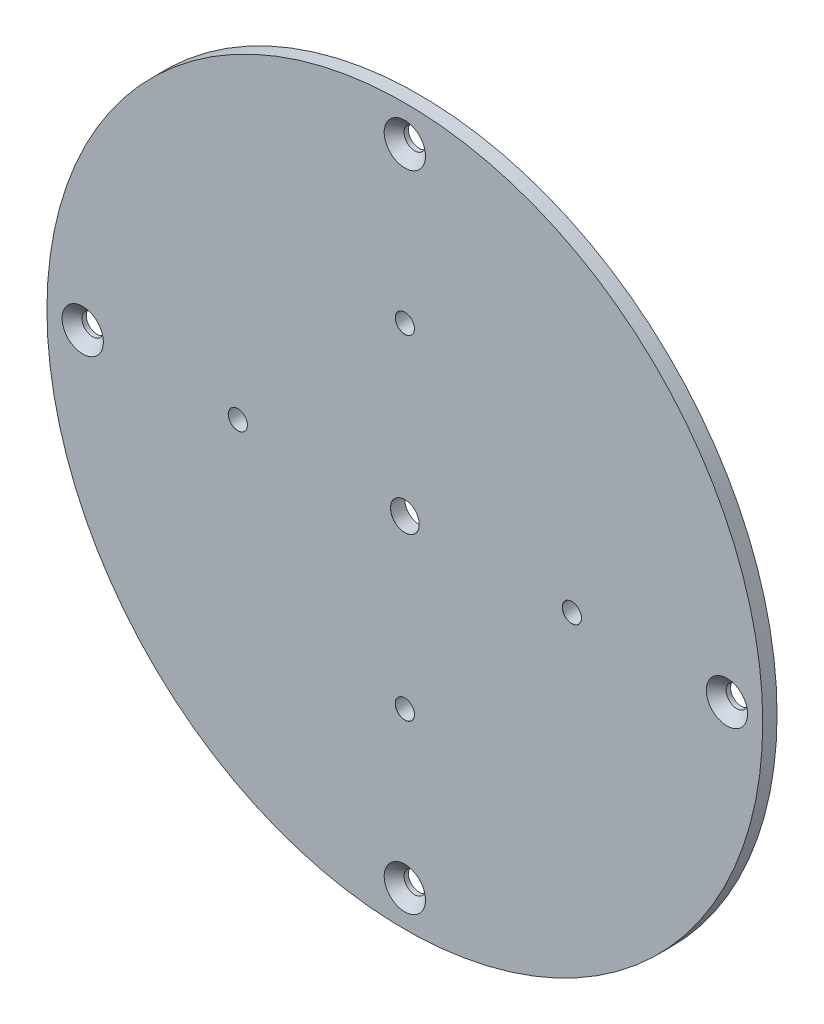
ISO-10303-21;
HEADER;
FILE_DESCRIPTION(('STEP AP214'),'2;1');
FILE_NAME('part.step','',(''),(''),'','','');
FILE_SCHEMA(('AUTOMOTIVE_DESIGN { 1 0 10303 214 1 1 1 1 }'));
ENDSEC;
DATA;
#1=APPLICATION_CONTEXT('core data for automotive mechanical design processes');
#2=APPLICATION_PROTOCOL_DEFINITION('international standard','automotive_design',2000,#1);
#3=PRODUCT_CONTEXT('',#1,'mechanical');
#4=PRODUCT('Part','Part','',(#3));
#5=PRODUCT_RELATED_PRODUCT_CATEGORY('part','',(#4));
#6=PRODUCT_DEFINITION_FORMATION('','',#4);
#7=PRODUCT_DEFINITION_CONTEXT('part definition',#1,'design');
#8=PRODUCT_DEFINITION('design','',#6,#7);
#9=PRODUCT_DEFINITION_SHAPE('','',#8);
#10=(LENGTH_UNIT() NAMED_UNIT(*) SI_UNIT(.MILLI.,.METRE.));
#11=(NAMED_UNIT(*) PLANE_ANGLE_UNIT() SI_UNIT($,.RADIAN.));
#12=(NAMED_UNIT(*) SI_UNIT($,.STERADIAN.) SOLID_ANGLE_UNIT());
#13=UNCERTAINTY_MEASURE_WITH_UNIT(LENGTH_MEASURE(1.E-05),#10,'distance_accuracy_value','');
#14=(GEOMETRIC_REPRESENTATION_CONTEXT(3) GLOBAL_UNCERTAINTY_ASSIGNED_CONTEXT((#13)) GLOBAL_UNIT_ASSIGNED_CONTEXT((#10,
#11,#12)) REPRESENTATION_CONTEXT('',''));
#15=CARTESIAN_POINT('',(0.,0.,0.));
#16=DIRECTION('',(0.,0.,1.));
#17=DIRECTION('',(1.,0.,0.));
#18=AXIS2_PLACEMENT_3D('',#15,#16,#17);
#19=CARTESIAN_POINT('',(0.,0.,6.));
#20=DIRECTION('',(0.,0.,-1.));
#21=DIRECTION('',(-1.,0.,0.));
#22=AXIS2_PLACEMENT_3D('',#19,#20,#21);
#23=CYLINDRICAL_SURFACE('',#22,150.);
#24=CARTESIAN_POINT('',(0.,0.,6.));
#25=DIRECTION('',(0.,0.,1.));
#26=DIRECTION('',(1.,0.,0.));
#27=AXIS2_PLACEMENT_3D('',#24,#25,#26);
#28=CIRCLE('',#27,150.);
#29=CARTESIAN_POINT('',(150.,0.,6.));
#30=VERTEX_POINT('',#29);
#31=EDGE_CURVE('E10',#30,#30,#28,.T.);
#32=ORIENTED_EDGE('',*,*,#31,.F.);
#33=EDGE_LOOP('',(#32));
#34=FACE_BOUND('',#33,.T.);
#35=CARTESIAN_POINT('',(0.,0.,0.));
#36=DIRECTION('',(0.,0.,1.));
#37=DIRECTION('',(1.,0.,0.));
#38=AXIS2_PLACEMENT_3D('',#35,#36,#37);
#39=CIRCLE('',#38,150.);
#40=CARTESIAN_POINT('',(150.,0.,0.));
#41=VERTEX_POINT('',#40);
#42=EDGE_CURVE('E37',#41,#41,#39,.T.);
#43=ORIENTED_EDGE('',*,*,#42,.T.);
#44=EDGE_LOOP('',(#43));
#45=FACE_BOUND('',#44,.T.);
#46=ADVANCED_FACE('F34',(#34,#45),#23,.T.);
#47=CARTESIAN_POINT('',(0.,0.,6.));
#48=DIRECTION('',(0.,0.,1.));
#49=DIRECTION('',(1.,0.,0.));
#50=AXIS2_PLACEMENT_3D('',#47,#48,#49);
#51=PLANE('',#50);
#52=CARTESIAN_POINT('',(0.,135.,6.));
#53=DIRECTION('',(0.,0.,1.));
#54=DIRECTION('',(1.,0.,0.));
#55=AXIS2_PLACEMENT_3D('',#52,#53,#54);
#56=CIRCLE('',#55,8.65);
#57=CARTESIAN_POINT('',(8.65,135.,6.));
#58=VERTEX_POINT('',#57);
#59=EDGE_CURVE('E123',#58,#58,#56,.T.);
#60=ORIENTED_EDGE('',*,*,#59,.F.);
#61=EDGE_LOOP('',(#60));
#62=FACE_BOUND('',#61,.T.);
#63=CARTESIAN_POINT('',(135.000000000004,3.81213167542181E-12,6.));
#64=DIRECTION('',(0.,0.,1.));
#65=DIRECTION('',(1.,0.,0.));
#66=AXIS2_PLACEMENT_3D('',#63,#64,#65);
#67=CIRCLE('',#66,8.64999999999999);
#68=CARTESIAN_POINT('',(143.650000000004,3.81213167542181E-12,6.));
#69=VERTEX_POINT('',#68);
#70=EDGE_CURVE('E114',#69,#69,#67,.T.);
#71=ORIENTED_EDGE('',*,*,#70,.F.);
#72=EDGE_LOOP('',(#71));
#73=FACE_BOUND('',#72,.T.);
#74=CARTESIAN_POINT('',(7.62426335084362E-12,-135.,6.));
#75=DIRECTION('',(0.,0.,1.));
#76=DIRECTION('',(1.,0.,0.));
#77=AXIS2_PLACEMENT_3D('',#74,#75,#76);
#78=CIRCLE('',#77,8.65);
#79=CARTESIAN_POINT('',(8.65000000000762,-135.,6.));
#80=VERTEX_POINT('',#79);
#81=EDGE_CURVE('E105',#80,#80,#78,.T.);
#82=ORIENTED_EDGE('',*,*,#81,.F.);
#83=EDGE_LOOP('',(#82));
#84=FACE_BOUND('',#83,.T.);
#85=CARTESIAN_POINT('',(-134.999999999996,-3.79559894363332E-12,6.));
#86=DIRECTION('',(0.,0.,1.));
#87=DIRECTION('',(1.,0.,0.));
#88=AXIS2_PLACEMENT_3D('',#85,#86,#87);
#89=CIRCLE('',#88,8.64999999999999);
#90=CARTESIAN_POINT('',(-126.349999999996,-3.79559894363332E-12,6.));
#91=VERTEX_POINT('',#90);
#92=EDGE_CURVE('E96',#91,#91,#89,.T.);
#93=ORIENTED_EDGE('',*,*,#92,.F.);
#94=EDGE_LOOP('',(#93));
#95=FACE_BOUND('',#94,.T.);
#96=CARTESIAN_POINT('',(0.,0.,6.));
#97=DIRECTION('',(0.,0.,1.));
#98=DIRECTION('',(1.,0.,0.));
#99=AXIS2_PLACEMENT_3D('',#96,#97,#98);
#100=CIRCLE('',#99,6.025);
#101=CARTESIAN_POINT('',(6.025,0.,6.));
#102=VERTEX_POINT('',#101);
#103=EDGE_CURVE('E87',#102,#102,#100,.T.);
#104=ORIENTED_EDGE('',*,*,#103,.F.);
#105=EDGE_LOOP('',(#104));
#106=FACE_BOUND('',#105,.T.);
#107=CARTESIAN_POINT('',(0.,70.,6.));
#108=DIRECTION('',(0.,0.,1.));
#109=DIRECTION('',(1.,0.,0.));
#110=AXIS2_PLACEMENT_3D('',#107,#108,#109);
#111=CIRCLE('',#110,4.025);
#112=CARTESIAN_POINT('',(4.025,70.,6.));
#113=VERTEX_POINT('',#112);
#114=EDGE_CURVE('E78',#113,#113,#111,.T.);
#115=ORIENTED_EDGE('',*,*,#114,.F.);
#116=EDGE_LOOP('',(#115));
#117=FACE_BOUND('',#116,.T.);
#118=CARTESIAN_POINT('',(0.,-70.,6.));
#119=DIRECTION('',(0.,0.,1.));
#120=DIRECTION('',(1.,0.,0.));
#121=AXIS2_PLACEMENT_3D('',#118,#119,#120);
#122=CIRCLE('',#121,4.025);
#123=CARTESIAN_POINT('',(4.025,-70.,6.));
#124=VERTEX_POINT('',#123);
#125=EDGE_CURVE('E69',#124,#124,#122,.T.);
#126=ORIENTED_EDGE('',*,*,#125,.F.);
#127=EDGE_LOOP('',(#126));
#128=FACE_BOUND('',#127,.T.);
#129=CARTESIAN_POINT('',(-70.,0.,6.));
#130=DIRECTION('',(0.,0.,1.));
#131=DIRECTION('',(1.,0.,0.));
#132=AXIS2_PLACEMENT_3D('',#129,#130,#131);
#133=CIRCLE('',#132,4.025);
#134=CARTESIAN_POINT('',(-65.975,0.,6.));
#135=VERTEX_POINT('',#134);
#136=EDGE_CURVE('E60',#135,#135,#133,.T.);
#137=ORIENTED_EDGE('',*,*,#136,.F.);
#138=EDGE_LOOP('',(#137));
#139=FACE_BOUND('',#138,.T.);
#140=CARTESIAN_POINT('',(70.,0.,6.));
#141=DIRECTION('',(0.,0.,1.));
#142=DIRECTION('',(1.,0.,0.));
#143=AXIS2_PLACEMENT_3D('',#140,#141,#142);
#144=CIRCLE('',#143,4.025);
#145=CARTESIAN_POINT('',(74.025,0.,6.));
#146=VERTEX_POINT('',#145);
#147=EDGE_CURVE('E51',#146,#146,#144,.T.);
#148=ORIENTED_EDGE('',*,*,#147,.F.);
#149=EDGE_LOOP('',(#148));
#150=FACE_BOUND('',#149,.T.);
#151=ORIENTED_EDGE('',*,*,#31,.T.);
#152=EDGE_LOOP('',(#151));
#153=FACE_BOUND('',#152,.T.);
#154=ADVANCED_FACE('F129',(#62,#73,#84,#95,#106,#117,#128,#139,#150,#153),#51,.T.);
#155=CARTESIAN_POINT('',(0.,0.,0.));
#156=DIRECTION('',(0.,0.,1.));
#157=DIRECTION('',(1.,0.,0.));
#158=AXIS2_PLACEMENT_3D('',#155,#156,#157);
#159=PLANE('',#158);
#160=CARTESIAN_POINT('',(0.,135.,0.));
#161=DIRECTION('',(0.,0.,1.));
#162=DIRECTION('',(1.,0.,0.));
#163=AXIS2_PLACEMENT_3D('',#160,#161,#162);
#164=CIRCLE('',#163,4.5);
#165=CARTESIAN_POINT('',(4.5,135.,0.));
#166=VERTEX_POINT('',#165);
#167=EDGE_CURVE('E117',#166,#166,#164,.T.);
#168=ORIENTED_EDGE('',*,*,#167,.T.);
#169=EDGE_LOOP('',(#168));
#170=FACE_BOUND('',#169,.T.);
#171=CARTESIAN_POINT('',(135.000000000004,3.81213167542181E-12,0.));
#172=DIRECTION('',(0.,0.,1.));
#173=DIRECTION('',(1.,0.,0.));
#174=AXIS2_PLACEMENT_3D('',#171,#172,#173);
#175=CIRCLE('',#174,4.5);
#176=CARTESIAN_POINT('',(139.500000000004,3.81213167542181E-12,0.));
#177=VERTEX_POINT('',#176);
#178=EDGE_CURVE('E108',#177,#177,#175,.T.);
#179=ORIENTED_EDGE('',*,*,#178,.T.);
#180=EDGE_LOOP('',(#179));
#181=FACE_BOUND('',#180,.T.);
#182=CARTESIAN_POINT('',(7.62426335084362E-12,-135.,0.));
#183=DIRECTION('',(0.,0.,1.));
#184=DIRECTION('',(1.,0.,0.));
#185=AXIS2_PLACEMENT_3D('',#182,#183,#184);
#186=CIRCLE('',#185,4.5);
#187=CARTESIAN_POINT('',(4.50000000000762,-135.,0.));
#188=VERTEX_POINT('',#187);
#189=EDGE_CURVE('E99',#188,#188,#186,.T.);
#190=ORIENTED_EDGE('',*,*,#189,.T.);
#191=EDGE_LOOP('',(#190));
#192=FACE_BOUND('',#191,.T.);
#193=CARTESIAN_POINT('',(-134.999999999996,-3.79559894363332E-12,0.));
#194=DIRECTION('',(0.,0.,1.));
#195=DIRECTION('',(1.,0.,0.));
#196=AXIS2_PLACEMENT_3D('',#193,#194,#195);
#197=CIRCLE('',#196,4.5);
#198=CARTESIAN_POINT('',(-130.499999999996,-3.79559894363332E-12,0.));
#199=VERTEX_POINT('',#198);
#200=EDGE_CURVE('E90',#199,#199,#197,.T.);
#201=ORIENTED_EDGE('',*,*,#200,.T.);
#202=EDGE_LOOP('',(#201));
#203=FACE_BOUND('',#202,.T.);
#204=CARTESIAN_POINT('',(0.,0.,0.));
#205=DIRECTION('',(0.,0.,1.));
#206=DIRECTION('',(1.,0.,0.));
#207=AXIS2_PLACEMENT_3D('',#204,#205,#206);
#208=CIRCLE('',#207,6.);
#209=CARTESIAN_POINT('',(6.,0.,0.));
#210=VERTEX_POINT('',#209);
#211=EDGE_CURVE('E81',#210,#210,#208,.T.);
#212=ORIENTED_EDGE('',*,*,#211,.T.);
#213=EDGE_LOOP('',(#212));
#214=FACE_BOUND('',#213,.T.);
#215=CARTESIAN_POINT('',(0.,70.,0.));
#216=DIRECTION('',(0.,0.,1.));
#217=DIRECTION('',(1.,0.,0.));
#218=AXIS2_PLACEMENT_3D('',#215,#216,#217);
#219=CIRCLE('',#218,4.);
#220=CARTESIAN_POINT('',(4.,70.,0.));
#221=VERTEX_POINT('',#220);
#222=EDGE_CURVE('E72',#221,#221,#219,.T.);
#223=ORIENTED_EDGE('',*,*,#222,.T.);
#224=EDGE_LOOP('',(#223));
#225=FACE_BOUND('',#224,.T.);
#226=CARTESIAN_POINT('',(0.,-70.,0.));
#227=DIRECTION('',(0.,0.,1.));
#228=DIRECTION('',(1.,0.,0.));
#229=AXIS2_PLACEMENT_3D('',#226,#227,#228);
#230=CIRCLE('',#229,4.);
#231=CARTESIAN_POINT('',(4.,-70.,0.));
#232=VERTEX_POINT('',#231);
#233=EDGE_CURVE('E63',#232,#232,#230,.T.);
#234=ORIENTED_EDGE('',*,*,#233,.T.);
#235=EDGE_LOOP('',(#234));
#236=FACE_BOUND('',#235,.T.);
#237=CARTESIAN_POINT('',(-70.,0.,0.));
#238=DIRECTION('',(0.,0.,1.));
#239=DIRECTION('',(1.,0.,0.));
#240=AXIS2_PLACEMENT_3D('',#237,#238,#239);
#241=CIRCLE('',#240,4.);
#242=CARTESIAN_POINT('',(-66.,0.,0.));
#243=VERTEX_POINT('',#242);
#244=EDGE_CURVE('E54',#243,#243,#241,.T.);
#245=ORIENTED_EDGE('',*,*,#244,.T.);
#246=EDGE_LOOP('',(#245));
#247=FACE_BOUND('',#246,.T.);
#248=CARTESIAN_POINT('',(70.,0.,0.));
#249=DIRECTION('',(0.,0.,1.));
#250=DIRECTION('',(1.,0.,0.));
#251=AXIS2_PLACEMENT_3D('',#248,#249,#250);
#252=CIRCLE('',#251,4.);
#253=CARTESIAN_POINT('',(74.,0.,0.));
#254=VERTEX_POINT('',#253);
#255=EDGE_CURVE('E44',#254,#254,#252,.T.);
#256=ORIENTED_EDGE('',*,*,#255,.T.);
#257=EDGE_LOOP('',(#256));
#258=FACE_BOUND('',#257,.T.);
#259=ORIENTED_EDGE('',*,*,#42,.F.);
#260=EDGE_LOOP('',(#259));
#261=FACE_BOUND('',#260,.T.);
#262=ADVANCED_FACE('F132',(#170,#181,#192,#203,#214,#225,#236,#247,#258,#261),#159,.F.);
#263=CARTESIAN_POINT('',(70.,0.,6.));
#264=DIRECTION('',(0.,0.,1.));
#265=DIRECTION('',(1.,0.,0.));
#266=AXIS2_PLACEMENT_3D('',#263,#264,#265);
#267=CYLINDRICAL_SURFACE('',#266,4.);
#268=ORIENTED_EDGE('',*,*,#255,.F.);
#269=EDGE_LOOP('',(#268));
#270=FACE_BOUND('',#269,.T.);
#271=CARTESIAN_POINT('',(70.,0.,5.975));
#272=DIRECTION('',(0.,0.,1.));
#273=DIRECTION('',(1.,0.,0.));
#274=AXIS2_PLACEMENT_3D('',#271,#272,#273);
#275=CIRCLE('',#274,4.);
#276=CARTESIAN_POINT('',(74.,0.,5.975));
#277=VERTEX_POINT('',#276);
#278=EDGE_CURVE('E48',#277,#277,#275,.T.);
#279=ORIENTED_EDGE('',*,*,#278,.T.);
#280=EDGE_LOOP('',(#279));
#281=FACE_BOUND('',#280,.T.);
#282=ADVANCED_FACE('F153',(#270,#281),#267,.F.);
#283=CARTESIAN_POINT('',(70.,0.,6.));
#284=DIRECTION('',(0.,0.,1.));
#285=DIRECTION('',(1.,0.,0.));
#286=AXIS2_PLACEMENT_3D('',#283,#284,#285);
#287=CONICAL_SURFACE('',#286,4.025,0.785398163397344);
#288=ORIENTED_EDGE('',*,*,#278,.F.);
#289=EDGE_LOOP('',(#288));
#290=FACE_BOUND('',#289,.T.);
#291=ORIENTED_EDGE('',*,*,#147,.T.);
#292=EDGE_LOOP('',(#291));
#293=FACE_BOUND('',#292,.T.);
#294=ADVANCED_FACE('F150',(#290,#293),#287,.F.);
#295=CARTESIAN_POINT('',(-70.,0.,6.));
#296=DIRECTION('',(0.,0.,1.));
#297=DIRECTION('',(1.,0.,0.));
#298=AXIS2_PLACEMENT_3D('',#295,#296,#297);
#299=CYLINDRICAL_SURFACE('',#298,4.);
#300=ORIENTED_EDGE('',*,*,#244,.F.);
#301=EDGE_LOOP('',(#300));
#302=FACE_BOUND('',#301,.T.);
#303=CARTESIAN_POINT('',(-70.,0.,5.975));
#304=DIRECTION('',(0.,0.,1.));
#305=DIRECTION('',(1.,0.,0.));
#306=AXIS2_PLACEMENT_3D('',#303,#304,#305);
#307=CIRCLE('',#306,4.);
#308=CARTESIAN_POINT('',(-66.,0.,5.975));
#309=VERTEX_POINT('',#308);
#310=EDGE_CURVE('E57',#309,#309,#307,.T.);
#311=ORIENTED_EDGE('',*,*,#310,.T.);
#312=EDGE_LOOP('',(#311));
#313=FACE_BOUND('',#312,.T.);
#314=ADVANCED_FACE('F152',(#302,#313),#299,.F.);
#315=CARTESIAN_POINT('',(-70.,0.,6.));
#316=DIRECTION('',(0.,0.,1.));
#317=DIRECTION('',(1.,0.,0.));
#318=AXIS2_PLACEMENT_3D('',#315,#316,#317);
#319=CONICAL_SURFACE('',#318,4.025,0.785398163397344);
#320=ORIENTED_EDGE('',*,*,#310,.F.);
#321=EDGE_LOOP('',(#320));
#322=FACE_BOUND('',#321,.T.);
#323=ORIENTED_EDGE('',*,*,#136,.T.);
#324=EDGE_LOOP('',(#323));
#325=FACE_BOUND('',#324,.T.);
#326=ADVANCED_FACE('F160',(#322,#325),#319,.F.);
#327=CARTESIAN_POINT('',(0.,-70.,6.));
#328=DIRECTION('',(0.,0.,1.));
#329=DIRECTION('',(1.,0.,0.));
#330=AXIS2_PLACEMENT_3D('',#327,#328,#329);
#331=CYLINDRICAL_SURFACE('',#330,4.);
#332=ORIENTED_EDGE('',*,*,#233,.F.);
#333=EDGE_LOOP('',(#332));
#334=FACE_BOUND('',#333,.T.);
#335=CARTESIAN_POINT('',(0.,-70.,5.975));
#336=DIRECTION('',(0.,0.,1.));
#337=DIRECTION('',(1.,0.,0.));
#338=AXIS2_PLACEMENT_3D('',#335,#336,#337);
#339=CIRCLE('',#338,4.);
#340=CARTESIAN_POINT('',(4.,-70.,5.975));
#341=VERTEX_POINT('',#340);
#342=EDGE_CURVE('E66',#341,#341,#339,.T.);
#343=ORIENTED_EDGE('',*,*,#342,.T.);
#344=EDGE_LOOP('',(#343));
#345=FACE_BOUND('',#344,.T.);
#346=ADVANCED_FACE('F200',(#334,#345),#331,.F.);
#347=CARTESIAN_POINT('',(0.,-70.,6.));
#348=DIRECTION('',(0.,0.,1.));
#349=DIRECTION('',(1.,0.,0.));
#350=AXIS2_PLACEMENT_3D('',#347,#348,#349);
#351=CONICAL_SURFACE('',#350,4.025,0.785398163397414);
#352=ORIENTED_EDGE('',*,*,#342,.F.);
#353=EDGE_LOOP('',(#352));
#354=FACE_BOUND('',#353,.T.);
#355=ORIENTED_EDGE('',*,*,#125,.T.);
#356=EDGE_LOOP('',(#355));
#357=FACE_BOUND('',#356,.T.);
#358=ADVANCED_FACE('F205',(#354,#357),#351,.F.);
#359=CARTESIAN_POINT('',(0.,70.,6.));
#360=DIRECTION('',(0.,0.,1.));
#361=DIRECTION('',(1.,0.,0.));
#362=AXIS2_PLACEMENT_3D('',#359,#360,#361);
#363=CYLINDRICAL_SURFACE('',#362,4.);
#364=ORIENTED_EDGE('',*,*,#222,.F.);
#365=EDGE_LOOP('',(#364));
#366=FACE_BOUND('',#365,.T.);
#367=CARTESIAN_POINT('',(0.,70.,5.975));
#368=DIRECTION('',(0.,0.,1.));
#369=DIRECTION('',(1.,0.,0.));
#370=AXIS2_PLACEMENT_3D('',#367,#368,#369);
#371=CIRCLE('',#370,4.);
#372=CARTESIAN_POINT('',(4.,70.,5.975));
#373=VERTEX_POINT('',#372);
#374=EDGE_CURVE('E75',#373,#373,#371,.T.);
#375=ORIENTED_EDGE('',*,*,#374,.T.);
#376=EDGE_LOOP('',(#375));
#377=FACE_BOUND('',#376,.T.);
#378=ADVANCED_FACE('F211',(#366,#377),#363,.F.);
#379=CARTESIAN_POINT('',(0.,70.,6.));
#380=DIRECTION('',(0.,0.,1.));
#381=DIRECTION('',(1.,0.,0.));
#382=AXIS2_PLACEMENT_3D('',#379,#380,#381);
#383=CONICAL_SURFACE('',#382,4.025,0.785398163397414);
#384=ORIENTED_EDGE('',*,*,#374,.F.);
#385=EDGE_LOOP('',(#384));
#386=FACE_BOUND('',#385,.T.);
#387=ORIENTED_EDGE('',*,*,#114,.T.);
#388=EDGE_LOOP('',(#387));
#389=FACE_BOUND('',#388,.T.);
#390=ADVANCED_FACE('F215',(#386,#389),#383,.F.);
#391=CARTESIAN_POINT('',(0.,0.,6.));
#392=DIRECTION('',(0.,0.,1.));
#393=DIRECTION('',(1.,0.,0.));
#394=AXIS2_PLACEMENT_3D('',#391,#392,#393);
#395=CYLINDRICAL_SURFACE('',#394,6.);
#396=ORIENTED_EDGE('',*,*,#211,.F.);
#397=EDGE_LOOP('',(#396));
#398=FACE_BOUND('',#397,.T.);
#399=CARTESIAN_POINT('',(0.,0.,5.975));
#400=DIRECTION('',(0.,0.,1.));
#401=DIRECTION('',(1.,0.,0.));
#402=AXIS2_PLACEMENT_3D('',#399,#400,#401);
#403=CIRCLE('',#402,6.);
#404=CARTESIAN_POINT('',(6.,0.,5.975));
#405=VERTEX_POINT('',#404);
#406=EDGE_CURVE('E84',#405,#405,#403,.T.);
#407=ORIENTED_EDGE('',*,*,#406,.T.);
#408=EDGE_LOOP('',(#407));
#409=FACE_BOUND('',#408,.T.);
#410=ADVANCED_FACE('F219',(#398,#409),#395,.F.);
#411=CARTESIAN_POINT('',(0.,0.,6.));
#412=DIRECTION('',(0.,0.,1.));
#413=DIRECTION('',(1.,0.,0.));
#414=AXIS2_PLACEMENT_3D('',#411,#412,#413);
#415=CONICAL_SURFACE('',#414,6.025,0.785398163397466);
#416=ORIENTED_EDGE('',*,*,#406,.F.);
#417=EDGE_LOOP('',(#416));
#418=FACE_BOUND('',#417,.T.);
#419=ORIENTED_EDGE('',*,*,#103,.T.);
#420=EDGE_LOOP('',(#419));
#421=FACE_BOUND('',#420,.T.);
#422=ADVANCED_FACE('F223',(#418,#421),#415,.F.);
#423=CARTESIAN_POINT('',(-134.999999999996,-3.79559894363332E-12,6.));
#424=DIRECTION('',(0.,0.,1.));
#425=DIRECTION('',(1.,0.,0.));
#426=AXIS2_PLACEMENT_3D('',#423,#424,#425);
#427=CYLINDRICAL_SURFACE('',#426,4.5);
#428=ORIENTED_EDGE('',*,*,#200,.F.);
#429=EDGE_LOOP('',(#428));
#430=FACE_BOUND('',#429,.T.);
#431=CARTESIAN_POINT('',(-134.999999999996,-3.79559894363332E-12,1.85));
#432=DIRECTION('',(0.,0.,1.));
#433=DIRECTION('',(1.,0.,0.));
#434=AXIS2_PLACEMENT_3D('',#431,#432,#433);
#435=CIRCLE('',#434,4.5);
#436=CARTESIAN_POINT('',(-130.499999999996,-3.79559894363332E-12,1.85));
#437=VERTEX_POINT('',#436);
#438=EDGE_CURVE('E93',#437,#437,#435,.T.);
#439=ORIENTED_EDGE('',*,*,#438,.T.);
#440=EDGE_LOOP('',(#439));
#441=FACE_BOUND('',#440,.T.);
#442=ADVANCED_FACE('F227',(#430,#441),#427,.F.);
#443=CARTESIAN_POINT('',(-134.999999999996,-3.79559894363332E-12,6.));
#444=DIRECTION('',(0.,0.,1.));
#445=DIRECTION('',(1.,0.,0.));
#446=AXIS2_PLACEMENT_3D('',#443,#444,#445);
#447=CONICAL_SURFACE('',#446,8.64999999999999,0.785398163397447);
#448=ORIENTED_EDGE('',*,*,#438,.F.);
#449=EDGE_LOOP('',(#448));
#450=FACE_BOUND('',#449,.T.);
#451=ORIENTED_EDGE('',*,*,#92,.T.);
#452=EDGE_LOOP('',(#451));
#453=FACE_BOUND('',#452,.T.);
#454=ADVANCED_FACE('F231',(#450,#453),#447,.F.);
#455=CARTESIAN_POINT('',(7.62426335084362E-12,-135.,6.));
#456=DIRECTION('',(0.,0.,1.));
#457=DIRECTION('',(1.,0.,0.));
#458=AXIS2_PLACEMENT_3D('',#455,#456,#457);
#459=CYLINDRICAL_SURFACE('',#458,4.5);
#460=ORIENTED_EDGE('',*,*,#189,.F.);
#461=EDGE_LOOP('',(#460));
#462=FACE_BOUND('',#461,.T.);
#463=CARTESIAN_POINT('',(7.62426335084362E-12,-135.,1.85));
#464=DIRECTION('',(0.,0.,1.));
#465=DIRECTION('',(1.,0.,0.));
#466=AXIS2_PLACEMENT_3D('',#463,#464,#465);
#467=CIRCLE('',#466,4.5);
#468=CARTESIAN_POINT('',(4.50000000000762,-135.,1.85));
#469=VERTEX_POINT('',#468);
#470=EDGE_CURVE('E102',#469,#469,#467,.T.);
#471=ORIENTED_EDGE('',*,*,#470,.T.);
#472=EDGE_LOOP('',(#471));
#473=FACE_BOUND('',#472,.T.);
#474=ADVANCED_FACE('F235',(#462,#473),#459,.F.);
#475=CARTESIAN_POINT('',(7.62426335084362E-12,-135.,6.));
#476=DIRECTION('',(0.,0.,1.));
#477=DIRECTION('',(1.,0.,0.));
#478=AXIS2_PLACEMENT_3D('',#475,#476,#477);
#479=CONICAL_SURFACE('',#478,8.65,0.785398163397449);
#480=ORIENTED_EDGE('',*,*,#470,.F.);
#481=EDGE_LOOP('',(#480));
#482=FACE_BOUND('',#481,.T.);
#483=ORIENTED_EDGE('',*,*,#81,.T.);
#484=EDGE_LOOP('',(#483));
#485=FACE_BOUND('',#484,.T.);
#486=ADVANCED_FACE('F239',(#482,#485),#479,.F.);
#487=CARTESIAN_POINT('',(135.000000000004,3.81213167542181E-12,6.));
#488=DIRECTION('',(0.,0.,1.));
#489=DIRECTION('',(1.,0.,0.));
#490=AXIS2_PLACEMENT_3D('',#487,#488,#489);
#491=CYLINDRICAL_SURFACE('',#490,4.5);
#492=ORIENTED_EDGE('',*,*,#178,.F.);
#493=EDGE_LOOP('',(#492));
#494=FACE_BOUND('',#493,.T.);
#495=CARTESIAN_POINT('',(135.000000000004,3.81213167542181E-12,1.85));
#496=DIRECTION('',(0.,0.,1.));
#497=DIRECTION('',(1.,0.,0.));
#498=AXIS2_PLACEMENT_3D('',#495,#496,#497);
#499=CIRCLE('',#498,4.5);
#500=CARTESIAN_POINT('',(139.500000000004,3.81213167542181E-12,1.85));
#501=VERTEX_POINT('',#500);
#502=EDGE_CURVE('E111',#501,#501,#499,.T.);
#503=ORIENTED_EDGE('',*,*,#502,.T.);
#504=EDGE_LOOP('',(#503));
#505=FACE_BOUND('',#504,.T.);
#506=ADVANCED_FACE('F243',(#494,#505),#491,.F.);
#507=CARTESIAN_POINT('',(135.000000000004,3.81213167542181E-12,6.));
#508=DIRECTION('',(0.,0.,1.));
#509=DIRECTION('',(1.,0.,0.));
#510=AXIS2_PLACEMENT_3D('',#507,#508,#509);
#511=CONICAL_SURFACE('',#510,8.64999999999999,0.785398163397447);
#512=ORIENTED_EDGE('',*,*,#502,.F.);
#513=EDGE_LOOP('',(#512));
#514=FACE_BOUND('',#513,.T.);
#515=ORIENTED_EDGE('',*,*,#70,.T.);
#516=EDGE_LOOP('',(#515));
#517=FACE_BOUND('',#516,.T.);
#518=ADVANCED_FACE('F247',(#514,#517),#511,.F.);
#519=CARTESIAN_POINT('',(0.,135.,6.));
#520=DIRECTION('',(0.,0.,1.));
#521=DIRECTION('',(1.,0.,0.));
#522=AXIS2_PLACEMENT_3D('',#519,#520,#521);
#523=CYLINDRICAL_SURFACE('',#522,4.5);
#524=ORIENTED_EDGE('',*,*,#167,.F.);
#525=EDGE_LOOP('',(#524));
#526=FACE_BOUND('',#525,.T.);
#527=CARTESIAN_POINT('',(0.,135.,1.85));
#528=DIRECTION('',(0.,0.,1.));
#529=DIRECTION('',(1.,0.,0.));
#530=AXIS2_PLACEMENT_3D('',#527,#528,#529);
#531=CIRCLE('',#530,4.5);
#532=CARTESIAN_POINT('',(4.5,135.,1.85));
#533=VERTEX_POINT('',#532);
#534=EDGE_CURVE('E120',#533,#533,#531,.T.);
#535=ORIENTED_EDGE('',*,*,#534,.T.);
#536=EDGE_LOOP('',(#535));
#537=FACE_BOUND('',#536,.T.);
#538=ADVANCED_FACE('F251',(#526,#537),#523,.F.);
#539=CARTESIAN_POINT('',(0.,135.,6.));
#540=DIRECTION('',(0.,0.,1.));
#541=DIRECTION('',(1.,0.,0.));
#542=AXIS2_PLACEMENT_3D('',#539,#540,#541);
#543=CONICAL_SURFACE('',#542,8.65,0.785398163397449);
#544=ORIENTED_EDGE('',*,*,#534,.F.);
#545=EDGE_LOOP('',(#544));
#546=FACE_BOUND('',#545,.T.);
#547=ORIENTED_EDGE('',*,*,#59,.T.);
#548=EDGE_LOOP('',(#547));
#549=FACE_BOUND('',#548,.T.);
#550=ADVANCED_FACE('F127',(#546,#549),#543,.F.);
#551=CLOSED_SHELL('',(#46,#154,#262,#282,#294,#314,#326,#346,#358,#378,#390,#410,#422,#442,#454,
#474,#486,#506,#518,#538,#550));
#552=MANIFOLD_SOLID_BREP('B2',#551);
#553=ADVANCED_BREP_SHAPE_REPRESENTATION('',(#18,#552),#14);
#554=SHAPE_DEFINITION_REPRESENTATION(#9,#553);
ENDSEC;
END-ISO-10303-21;
